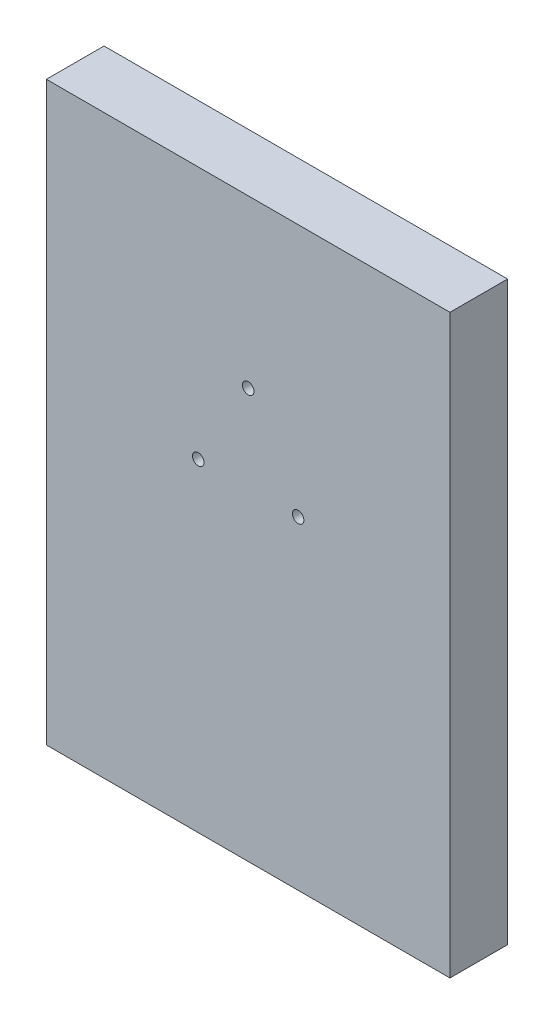
ISO-10303-21;
HEADER;
FILE_DESCRIPTION(('STEP AP214'),'2;1');
FILE_NAME('part.step','',(''),(''),'','','');
FILE_SCHEMA(('AUTOMOTIVE_DESIGN { 1 0 10303 214 1 1 1 1 }'));
ENDSEC;
DATA;
#1=APPLICATION_CONTEXT('core data for automotive mechanical design processes');
#2=APPLICATION_PROTOCOL_DEFINITION('international standard','automotive_design',2000,#1);
#3=PRODUCT_CONTEXT('',#1,'mechanical');
#4=PRODUCT('Part','Part','',(#3));
#5=PRODUCT_RELATED_PRODUCT_CATEGORY('part','',(#4));
#6=PRODUCT_DEFINITION_FORMATION('','',#4);
#7=PRODUCT_DEFINITION_CONTEXT('part definition',#1,'design');
#8=PRODUCT_DEFINITION('design','',#6,#7);
#9=PRODUCT_DEFINITION_SHAPE('','',#8);
#10=(LENGTH_UNIT() NAMED_UNIT(*) SI_UNIT(.MILLI.,.METRE.));
#11=(NAMED_UNIT(*) PLANE_ANGLE_UNIT() SI_UNIT($,.RADIAN.));
#12=(NAMED_UNIT(*) SI_UNIT($,.STERADIAN.) SOLID_ANGLE_UNIT());
#13=UNCERTAINTY_MEASURE_WITH_UNIT(LENGTH_MEASURE(1.E-05),#10,'distance_accuracy_value','');
#14=(GEOMETRIC_REPRESENTATION_CONTEXT(3) GLOBAL_UNCERTAINTY_ASSIGNED_CONTEXT((#13)) GLOBAL_UNIT_ASSIGNED_CONTEXT((#10,
#11,#12)) REPRESENTATION_CONTEXT('',''));
#15=CARTESIAN_POINT('',(0.,0.,0.));
#16=DIRECTION('',(0.,0.,1.));
#17=DIRECTION('',(1.,0.,0.));
#18=AXIS2_PLACEMENT_3D('',#15,#16,#17);
#19=CARTESIAN_POINT('',(35.,-50.,5.));
#20=DIRECTION('',(-1.,0.,0.));
#21=DIRECTION('',(0.,0.,1.));
#22=AXIS2_PLACEMENT_3D('',#19,#20,#21);
#23=PLANE('',#22);
#24=DIRECTION('',(0.,1.,0.));
#25=VECTOR('',#24,1.);
#26=CARTESIAN_POINT('',(35.,-50.,-5.));
#27=LINE('',#26,#25);
#28=CARTESIAN_POINT('',(35.,-50.,-5.));
#29=VERTEX_POINT('',#28);
#30=CARTESIAN_POINT('',(35.,50.,-5.));
#31=VERTEX_POINT('',#30);
#32=EDGE_CURVE('E96',#29,#31,#27,.T.);
#33=ORIENTED_EDGE('',*,*,#32,.T.);
#34=DIRECTION('',(0.,0.,-1.));
#35=VECTOR('',#34,1.);
#36=CARTESIAN_POINT('',(35.,50.,5.));
#37=LINE('',#36,#35);
#38=CARTESIAN_POINT('',(35.,50.,5.));
#39=VERTEX_POINT('',#38);
#40=EDGE_CURVE('E11',#39,#31,#37,.T.);
#41=ORIENTED_EDGE('',*,*,#40,.F.);
#42=DIRECTION('',(0.,1.,0.));
#43=VECTOR('',#42,1.);
#44=CARTESIAN_POINT('',(35.,-50.,5.));
#45=LINE('',#44,#43);
#46=CARTESIAN_POINT('',(35.,-50.,5.));
#47=VERTEX_POINT('',#46);
#48=EDGE_CURVE('E84',#47,#39,#45,.T.);
#49=ORIENTED_EDGE('',*,*,#48,.F.);
#50=DIRECTION('',(0.,0.,-1.));
#51=VECTOR('',#50,1.);
#52=CARTESIAN_POINT('',(35.,-50.,5.));
#53=LINE('',#52,#51);
#54=EDGE_CURVE('E92',#47,#29,#53,.T.);
#55=ORIENTED_EDGE('',*,*,#54,.T.);
#56=EDGE_LOOP('',(#33,#41,#49,#55));
#57=FACE_BOUND('',#56,.T.);
#58=ADVANCED_FACE('F33',(#57),#23,.F.);
#59=CARTESIAN_POINT('',(-35.,50.,5.));
#60=DIRECTION('',(0.,-1.,0.));
#61=DIRECTION('',(0.,0.,-1.));
#62=AXIS2_PLACEMENT_3D('',#59,#60,#61);
#63=PLANE('',#62);
#64=DIRECTION('',(-1.,0.,0.));
#65=VECTOR('',#64,1.);
#66=CARTESIAN_POINT('',(-35.,50.,-5.));
#67=LINE('',#66,#65);
#68=CARTESIAN_POINT('',(-35.,50.,-5.));
#69=VERTEX_POINT('',#68);
#70=EDGE_CURVE('E88',#31,#69,#67,.T.);
#71=ORIENTED_EDGE('',*,*,#70,.T.);
#72=DIRECTION('',(0.,0.,-1.));
#73=VECTOR('',#72,1.);
#74=CARTESIAN_POINT('',(-35.,50.,5.));
#75=LINE('',#74,#73);
#76=CARTESIAN_POINT('',(-35.,50.,5.));
#77=VERTEX_POINT('',#76);
#78=EDGE_CURVE('E41',#77,#69,#75,.T.);
#79=ORIENTED_EDGE('',*,*,#78,.F.);
#80=DIRECTION('',(-1.,0.,0.));
#81=VECTOR('',#80,1.);
#82=CARTESIAN_POINT('',(-35.,50.,5.));
#83=LINE('',#82,#81);
#84=EDGE_CURVE('E79',#39,#77,#83,.T.);
#85=ORIENTED_EDGE('',*,*,#84,.F.);
#86=ORIENTED_EDGE('',*,*,#40,.T.);
#87=EDGE_LOOP('',(#71,#79,#85,#86));
#88=FACE_BOUND('',#87,.T.);
#89=ADVANCED_FACE('F87',(#88),#63,.F.);
#90=CARTESIAN_POINT('',(-35.,-50.,5.));
#91=DIRECTION('',(1.,0.,0.));
#92=DIRECTION('',(0.,0.,-1.));
#93=AXIS2_PLACEMENT_3D('',#90,#91,#92);
#94=PLANE('',#93);
#95=DIRECTION('',(0.,-1.,0.));
#96=VECTOR('',#95,1.);
#97=CARTESIAN_POINT('',(-35.,-50.,-5.));
#98=LINE('',#97,#96);
#99=CARTESIAN_POINT('',(-35.,-50.,-5.));
#100=VERTEX_POINT('',#99);
#101=EDGE_CURVE('E66',#69,#100,#98,.T.);
#102=ORIENTED_EDGE('',*,*,#101,.T.);
#103=DIRECTION('',(0.,0.,-1.));
#104=VECTOR('',#103,1.);
#105=CARTESIAN_POINT('',(-35.,-50.,5.));
#106=LINE('',#105,#104);
#107=CARTESIAN_POINT('',(-35.,-50.,5.));
#108=VERTEX_POINT('',#107);
#109=EDGE_CURVE('E89',#108,#100,#106,.T.);
#110=ORIENTED_EDGE('',*,*,#109,.F.);
#111=DIRECTION('',(0.,-1.,0.));
#112=VECTOR('',#111,1.);
#113=CARTESIAN_POINT('',(-35.,-50.,5.));
#114=LINE('',#113,#112);
#115=EDGE_CURVE('E82',#77,#108,#114,.T.);
#116=ORIENTED_EDGE('',*,*,#115,.F.);
#117=ORIENTED_EDGE('',*,*,#78,.T.);
#118=EDGE_LOOP('',(#102,#110,#116,#117));
#119=FACE_BOUND('',#118,.T.);
#120=ADVANCED_FACE('F90',(#119),#94,.F.);
#121=CARTESIAN_POINT('',(-35.,-50.,5.));
#122=DIRECTION('',(0.,1.,0.));
#123=DIRECTION('',(0.,0.,1.));
#124=AXIS2_PLACEMENT_3D('',#121,#122,#123);
#125=PLANE('',#124);
#126=DIRECTION('',(1.,0.,0.));
#127=VECTOR('',#126,1.);
#128=CARTESIAN_POINT('',(-35.,-50.,-5.));
#129=LINE('',#128,#127);
#130=EDGE_CURVE('E72',#100,#29,#129,.T.);
#131=ORIENTED_EDGE('',*,*,#130,.T.);
#132=ORIENTED_EDGE('',*,*,#54,.F.);
#133=DIRECTION('',(1.,0.,0.));
#134=VECTOR('',#133,1.);
#135=CARTESIAN_POINT('',(-35.,-50.,5.));
#136=LINE('',#135,#134);
#137=EDGE_CURVE('E49',#108,#47,#136,.T.);
#138=ORIENTED_EDGE('',*,*,#137,.F.);
#139=ORIENTED_EDGE('',*,*,#109,.T.);
#140=EDGE_LOOP('',(#131,#132,#138,#139));
#141=FACE_BOUND('',#140,.T.);
#142=ADVANCED_FACE('F104',(#141),#125,.F.);
#143=CARTESIAN_POINT('',(0.,0.,5.));
#144=DIRECTION('',(0.,0.,-1.));
#145=DIRECTION('',(-1.,0.,0.));
#146=AXIS2_PLACEMENT_3D('',#143,#144,#145);
#147=PLANE('',#146);
#148=CARTESIAN_POINT('',(0.,21.0982953447832,5.));
#149=DIRECTION('',(0.,0.,1.));
#150=DIRECTION('',(1.,0.,0.));
#151=AXIS2_PLACEMENT_3D('',#148,#149,#150);
#152=CIRCLE('',#151,1.);
#153=CARTESIAN_POINT('',(1.,21.0982953447832,5.));
#154=VERTEX_POINT('',#153);
#155=EDGE_CURVE('E122',#154,#154,#152,.T.);
#156=ORIENTED_EDGE('',*,*,#155,.F.);
#157=EDGE_LOOP('',(#156));
#158=FACE_BOUND('',#157,.T.);
#159=CARTESIAN_POINT('',(8.66025403784522,6.09829534478364,5.));
#160=DIRECTION('',(0.,0.,1.));
#161=DIRECTION('',(1.,0.,0.));
#162=AXIS2_PLACEMENT_3D('',#159,#160,#161);
#163=CIRCLE('',#162,1.);
#164=CARTESIAN_POINT('',(9.66025403784522,6.09829534478364,5.));
#165=VERTEX_POINT('',#164);
#166=EDGE_CURVE('E116',#165,#165,#163,.T.);
#167=ORIENTED_EDGE('',*,*,#166,.F.);
#168=EDGE_LOOP('',(#167));
#169=FACE_BOUND('',#168,.T.);
#170=CARTESIAN_POINT('',(-8.66025403784358,6.09829534478278,5.));
#171=DIRECTION('',(0.,0.,1.));
#172=DIRECTION('',(1.,0.,0.));
#173=AXIS2_PLACEMENT_3D('',#170,#171,#172);
#174=CIRCLE('',#173,1.);
#175=CARTESIAN_POINT('',(-7.66025403784359,6.09829534478278,5.));
#176=VERTEX_POINT('',#175);
#177=EDGE_CURVE('E110',#176,#176,#174,.T.);
#178=ORIENTED_EDGE('',*,*,#177,.F.);
#179=EDGE_LOOP('',(#178));
#180=FACE_BOUND('',#179,.T.);
#181=ORIENTED_EDGE('',*,*,#48,.T.);
#182=ORIENTED_EDGE('',*,*,#84,.T.);
#183=ORIENTED_EDGE('',*,*,#115,.T.);
#184=ORIENTED_EDGE('',*,*,#137,.T.);
#185=EDGE_LOOP('',(#181,#182,#183,#184));
#186=FACE_BOUND('',#185,.T.);
#187=ADVANCED_FACE('F80',(#158,#169,#180,#186),#147,.F.);
#188=CARTESIAN_POINT('',(0.,0.,-5.));
#189=DIRECTION('',(0.,0.,-1.));
#190=DIRECTION('',(-1.,0.,0.));
#191=AXIS2_PLACEMENT_3D('',#188,#189,#190);
#192=PLANE('',#191);
#193=CARTESIAN_POINT('',(0.,21.0982953447832,-5.));
#194=DIRECTION('',(0.,0.,1.));
#195=DIRECTION('',(1.,0.,0.));
#196=AXIS2_PLACEMENT_3D('',#193,#194,#195);
#197=CIRCLE('',#196,1.);
#198=CARTESIAN_POINT('',(1.,21.0982953447832,-5.));
#199=VERTEX_POINT('',#198);
#200=EDGE_CURVE('E99',#199,#199,#197,.T.);
#201=ORIENTED_EDGE('',*,*,#200,.T.);
#202=EDGE_LOOP('',(#201));
#203=FACE_BOUND('',#202,.T.);
#204=CARTESIAN_POINT('',(8.66025403784522,6.09829534478364,-5.));
#205=DIRECTION('',(0.,0.,1.));
#206=DIRECTION('',(1.,0.,0.));
#207=AXIS2_PLACEMENT_3D('',#204,#205,#206);
#208=CIRCLE('',#207,1.);
#209=CARTESIAN_POINT('',(9.66025403784522,6.09829534478364,-5.));
#210=VERTEX_POINT('',#209);
#211=EDGE_CURVE('E119',#210,#210,#208,.T.);
#212=ORIENTED_EDGE('',*,*,#211,.T.);
#213=EDGE_LOOP('',(#212));
#214=FACE_BOUND('',#213,.T.);
#215=CARTESIAN_POINT('',(-8.66025403784358,6.09829534478278,-5.));
#216=DIRECTION('',(0.,0.,1.));
#217=DIRECTION('',(1.,0.,0.));
#218=AXIS2_PLACEMENT_3D('',#215,#216,#217);
#219=CIRCLE('',#218,1.);
#220=CARTESIAN_POINT('',(-7.66025403784359,6.09829534478278,-5.));
#221=VERTEX_POINT('',#220);
#222=EDGE_CURVE('E113',#221,#221,#219,.T.);
#223=ORIENTED_EDGE('',*,*,#222,.T.);
#224=EDGE_LOOP('',(#223));
#225=FACE_BOUND('',#224,.T.);
#226=ORIENTED_EDGE('',*,*,#32,.F.);
#227=ORIENTED_EDGE('',*,*,#130,.F.);
#228=ORIENTED_EDGE('',*,*,#101,.F.);
#229=ORIENTED_EDGE('',*,*,#70,.F.);
#230=EDGE_LOOP('',(#226,#227,#228,#229));
#231=FACE_BOUND('',#230,.T.);
#232=ADVANCED_FACE('F107',(#203,#214,#225,#231),#192,.T.);
#233=CARTESIAN_POINT('',(-8.66025403784358,6.09829534478278,-5.));
#234=DIRECTION('',(0.,0.,1.));
#235=DIRECTION('',(1.,0.,0.));
#236=AXIS2_PLACEMENT_3D('',#233,#234,#235);
#237=CYLINDRICAL_SURFACE('',#236,1.);
#238=ORIENTED_EDGE('',*,*,#222,.F.);
#239=EDGE_LOOP('',(#238));
#240=FACE_BOUND('',#239,.T.);
#241=ORIENTED_EDGE('',*,*,#177,.T.);
#242=EDGE_LOOP('',(#241));
#243=FACE_BOUND('',#242,.T.);
#244=ADVANCED_FACE('F144',(#240,#243),#237,.F.);
#245=CARTESIAN_POINT('',(8.66025403784522,6.09829534478364,-5.));
#246=DIRECTION('',(0.,0.,1.));
#247=DIRECTION('',(1.,0.,0.));
#248=AXIS2_PLACEMENT_3D('',#245,#246,#247);
#249=CYLINDRICAL_SURFACE('',#248,1.);
#250=ORIENTED_EDGE('',*,*,#211,.F.);
#251=EDGE_LOOP('',(#250));
#252=FACE_BOUND('',#251,.T.);
#253=ORIENTED_EDGE('',*,*,#166,.T.);
#254=EDGE_LOOP('',(#253));
#255=FACE_BOUND('',#254,.T.);
#256=ADVANCED_FACE('F133',(#252,#255),#249,.F.);
#257=CARTESIAN_POINT('',(0.,21.0982953447832,-5.));
#258=DIRECTION('',(0.,0.,1.));
#259=DIRECTION('',(1.,0.,0.));
#260=AXIS2_PLACEMENT_3D('',#257,#258,#259);
#261=CYLINDRICAL_SURFACE('',#260,1.);
#262=ORIENTED_EDGE('',*,*,#200,.F.);
#263=EDGE_LOOP('',(#262));
#264=FACE_BOUND('',#263,.T.);
#265=ORIENTED_EDGE('',*,*,#155,.T.);
#266=EDGE_LOOP('',(#265));
#267=FACE_BOUND('',#266,.T.);
#268=ADVANCED_FACE('F130',(#264,#267),#261,.F.);
#269=CLOSED_SHELL('',(#58,#89,#120,#142,#187,#232,#244,#256,#268));
#270=MANIFOLD_SOLID_BREP('B2',#269);
#271=ADVANCED_BREP_SHAPE_REPRESENTATION('',(#18,#270),#14);
#272=SHAPE_DEFINITION_REPRESENTATION(#9,#271);
ENDSEC;
END-ISO-10303-21;
